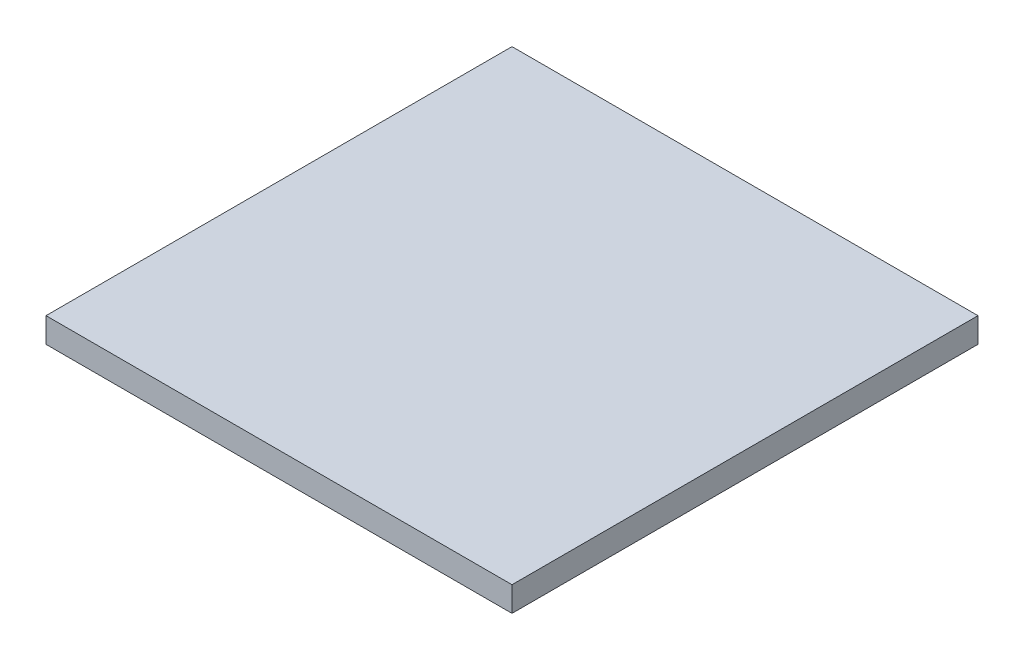
ISO-10303-21;
HEADER;
FILE_DESCRIPTION(('STEP AP214'),'2;1');
FILE_NAME('part.step','',(''),(''),'','','');
FILE_SCHEMA(('AUTOMOTIVE_DESIGN { 1 0 10303 214 1 1 1 1 }'));
ENDSEC;
DATA;
#1=APPLICATION_CONTEXT('core data for automotive mechanical design processes');
#2=APPLICATION_PROTOCOL_DEFINITION('international standard','automotive_design',2000,#1);
#3=PRODUCT_CONTEXT('',#1,'mechanical');
#4=PRODUCT('Part','Part','',(#3));
#5=PRODUCT_RELATED_PRODUCT_CATEGORY('part','',(#4));
#6=PRODUCT_DEFINITION_FORMATION('','',#4);
#7=PRODUCT_DEFINITION_CONTEXT('part definition',#1,'design');
#8=PRODUCT_DEFINITION('design','',#6,#7);
#9=PRODUCT_DEFINITION_SHAPE('','',#8);
#10=(LENGTH_UNIT() NAMED_UNIT(*) SI_UNIT(.MILLI.,.METRE.));
#11=(NAMED_UNIT(*) PLANE_ANGLE_UNIT() SI_UNIT($,.RADIAN.));
#12=(NAMED_UNIT(*) SI_UNIT($,.STERADIAN.) SOLID_ANGLE_UNIT());
#13=UNCERTAINTY_MEASURE_WITH_UNIT(LENGTH_MEASURE(1.E-05),#10,'distance_accuracy_value','');
#14=(GEOMETRIC_REPRESENTATION_CONTEXT(3) GLOBAL_UNCERTAINTY_ASSIGNED_CONTEXT((#13)) GLOBAL_UNIT_ASSIGNED_CONTEXT((#10,
#11,#12)) REPRESENTATION_CONTEXT('',''));
#15=CARTESIAN_POINT('',(0.,0.,0.));
#16=DIRECTION('',(0.,0.,1.));
#17=DIRECTION('',(1.,0.,0.));
#18=AXIS2_PLACEMENT_3D('',#15,#16,#17);
#19=CARTESIAN_POINT('',(75.0000000000001,-8.00000000000001,-75.));
#20=DIRECTION('',(1.,0.,0.));
#21=DIRECTION('',(0.,0.,-1.));
#22=AXIS2_PLACEMENT_3D('',#19,#20,#21);
#23=PLANE('',#22);
#24=DIRECTION('',(0.,0.,-1.));
#25=VECTOR('',#24,1.);
#26=CARTESIAN_POINT('',(75.0000000000001,0.,-75.));
#27=LINE('',#26,#25);
#28=CARTESIAN_POINT('',(75.0000000000001,0.,75.));
#29=VERTEX_POINT('',#28);
#30=CARTESIAN_POINT('',(75.0000000000001,0.,-75.));
#31=VERTEX_POINT('',#30);
#32=EDGE_CURVE('E103',#29,#31,#27,.T.);
#33=ORIENTED_EDGE('',*,*,#32,.F.);
#34=DIRECTION('',(0.,1.,0.));
#35=VECTOR('',#34,1.);
#36=CARTESIAN_POINT('',(75.0000000000001,-8.00000000000001,75.));
#37=LINE('',#36,#35);
#38=CARTESIAN_POINT('',(75.0000000000001,-8.00000000000001,75.));
#39=VERTEX_POINT('',#38);
#40=EDGE_CURVE('E11',#39,#29,#37,.T.);
#41=ORIENTED_EDGE('',*,*,#40,.F.);
#42=DIRECTION('',(0.,0.,-1.));
#43=VECTOR('',#42,1.);
#44=CARTESIAN_POINT('',(75.0000000000001,-8.00000000000001,-75.));
#45=LINE('',#44,#43);
#46=CARTESIAN_POINT('',(75.0000000000001,-8.00000000000001,-75.));
#47=VERTEX_POINT('',#46);
#48=EDGE_CURVE('E97',#39,#47,#45,.T.);
#49=ORIENTED_EDGE('',*,*,#48,.T.);
#50=DIRECTION('',(0.,1.,0.));
#51=VECTOR('',#50,1.);
#52=CARTESIAN_POINT('',(75.0000000000001,-8.00000000000001,-75.));
#53=LINE('',#52,#51);
#54=EDGE_CURVE('E42',#47,#31,#53,.T.);
#55=ORIENTED_EDGE('',*,*,#54,.T.);
#56=EDGE_LOOP('',(#33,#41,#49,#55));
#57=FACE_BOUND('',#56,.T.);
#58=ADVANCED_FACE('F39',(#57),#23,.T.);
#59=CARTESIAN_POINT('',(-75.,-8.00000000000001,75.));
#60=DIRECTION('',(0.,0.,1.));
#61=DIRECTION('',(1.,0.,0.));
#62=AXIS2_PLACEMENT_3D('',#59,#60,#61);
#63=PLANE('',#62);
#64=DIRECTION('',(1.,0.,0.));
#65=VECTOR('',#64,1.);
#66=CARTESIAN_POINT('',(-75.,0.,75.));
#67=LINE('',#66,#65);
#68=CARTESIAN_POINT('',(-75.,0.,75.));
#69=VERTEX_POINT('',#68);
#70=EDGE_CURVE('E99',#69,#29,#67,.T.);
#71=ORIENTED_EDGE('',*,*,#70,.F.);
#72=DIRECTION('',(0.,1.,0.));
#73=VECTOR('',#72,1.);
#74=CARTESIAN_POINT('',(-75.,-8.00000000000001,75.));
#75=LINE('',#74,#73);
#76=CARTESIAN_POINT('',(-75.,-8.00000000000001,75.));
#77=VERTEX_POINT('',#76);
#78=EDGE_CURVE('E48',#77,#69,#75,.T.);
#79=ORIENTED_EDGE('',*,*,#78,.F.);
#80=DIRECTION('',(1.,0.,0.));
#81=VECTOR('',#80,1.);
#82=CARTESIAN_POINT('',(-75.,-8.00000000000001,75.));
#83=LINE('',#82,#81);
#84=EDGE_CURVE('E94',#77,#39,#83,.T.);
#85=ORIENTED_EDGE('',*,*,#84,.T.);
#86=ORIENTED_EDGE('',*,*,#40,.T.);
#87=EDGE_LOOP('',(#71,#79,#85,#86));
#88=FACE_BOUND('',#87,.T.);
#89=ADVANCED_FACE('F113',(#88),#63,.T.);
#90=CARTESIAN_POINT('',(-75.,-8.00000000000001,-75.));
#91=DIRECTION('',(-1.,0.,0.));
#92=DIRECTION('',(0.,0.,1.));
#93=AXIS2_PLACEMENT_3D('',#90,#91,#92);
#94=PLANE('',#93);
#95=DIRECTION('',(0.,0.,1.));
#96=VECTOR('',#95,1.);
#97=CARTESIAN_POINT('',(-75.,0.,-75.));
#98=LINE('',#97,#96);
#99=CARTESIAN_POINT('',(-75.,0.,-75.));
#100=VERTEX_POINT('',#99);
#101=EDGE_CURVE('E89',#100,#69,#98,.T.);
#102=ORIENTED_EDGE('',*,*,#101,.F.);
#103=DIRECTION('',(0.,1.,0.));
#104=VECTOR('',#103,1.);
#105=CARTESIAN_POINT('',(-75.,-8.00000000000001,-75.));
#106=LINE('',#105,#104);
#107=CARTESIAN_POINT('',(-75.,-8.00000000000001,-75.));
#108=VERTEX_POINT('',#107);
#109=EDGE_CURVE('E84',#108,#100,#106,.T.);
#110=ORIENTED_EDGE('',*,*,#109,.F.);
#111=DIRECTION('',(0.,0.,1.));
#112=VECTOR('',#111,1.);
#113=CARTESIAN_POINT('',(-75.,-8.00000000000001,-75.));
#114=LINE('',#113,#112);
#115=EDGE_CURVE('E87',#108,#77,#114,.T.);
#116=ORIENTED_EDGE('',*,*,#115,.T.);
#117=ORIENTED_EDGE('',*,*,#78,.T.);
#118=EDGE_LOOP('',(#102,#110,#116,#117));
#119=FACE_BOUND('',#118,.T.);
#120=ADVANCED_FACE('F86',(#119),#94,.T.);
#121=CARTESIAN_POINT('',(-75.,-8.00000000000001,-75.));
#122=DIRECTION('',(0.,0.,-1.));
#123=DIRECTION('',(-1.,0.,0.));
#124=AXIS2_PLACEMENT_3D('',#121,#122,#123);
#125=PLANE('',#124);
#126=DIRECTION('',(-1.,0.,0.));
#127=VECTOR('',#126,1.);
#128=CARTESIAN_POINT('',(-75.,0.,-75.));
#129=LINE('',#128,#127);
#130=EDGE_CURVE('E106',#31,#100,#129,.T.);
#131=ORIENTED_EDGE('',*,*,#130,.F.);
#132=ORIENTED_EDGE('',*,*,#54,.F.);
#133=DIRECTION('',(-1.,0.,0.));
#134=VECTOR('',#133,1.);
#135=CARTESIAN_POINT('',(-75.,-8.00000000000001,-75.));
#136=LINE('',#135,#134);
#137=EDGE_CURVE('E93',#47,#108,#136,.T.);
#138=ORIENTED_EDGE('',*,*,#137,.T.);
#139=ORIENTED_EDGE('',*,*,#109,.T.);
#140=EDGE_LOOP('',(#131,#132,#138,#139));
#141=FACE_BOUND('',#140,.T.);
#142=ADVANCED_FACE('F96',(#141),#125,.T.);
#143=CARTESIAN_POINT('',(0.,-8.00000000000001,0.));
#144=DIRECTION('',(0.,1.,0.));
#145=DIRECTION('',(0.,0.,1.));
#146=AXIS2_PLACEMENT_3D('',#143,#144,#145);
#147=PLANE('',#146);
#148=ORIENTED_EDGE('',*,*,#48,.F.);
#149=ORIENTED_EDGE('',*,*,#84,.F.);
#150=ORIENTED_EDGE('',*,*,#115,.F.);
#151=ORIENTED_EDGE('',*,*,#137,.F.);
#152=EDGE_LOOP('',(#148,#149,#150,#151));
#153=FACE_BOUND('',#152,.T.);
#154=ADVANCED_FACE('F92',(#153),#147,.F.);
#155=CARTESIAN_POINT('',(0.,0.,0.));
#156=DIRECTION('',(0.,1.,0.));
#157=DIRECTION('',(0.,0.,1.));
#158=AXIS2_PLACEMENT_3D('',#155,#156,#157);
#159=PLANE('',#158);
#160=ORIENTED_EDGE('',*,*,#32,.T.);
#161=ORIENTED_EDGE('',*,*,#130,.T.);
#162=ORIENTED_EDGE('',*,*,#101,.T.);
#163=ORIENTED_EDGE('',*,*,#70,.T.);
#164=EDGE_LOOP('',(#160,#161,#162,#163));
#165=FACE_BOUND('',#164,.T.);
#166=ADVANCED_FACE('F112',(#165),#159,.T.);
#167=CLOSED_SHELL('',(#58,#89,#120,#142,#154,#166));
#168=MANIFOLD_SOLID_BREP('B2',#167);
#169=ADVANCED_BREP_SHAPE_REPRESENTATION('',(#18,#168),#14);
#170=SHAPE_DEFINITION_REPRESENTATION(#9,#169);
ENDSEC;
END-ISO-10303-21;
